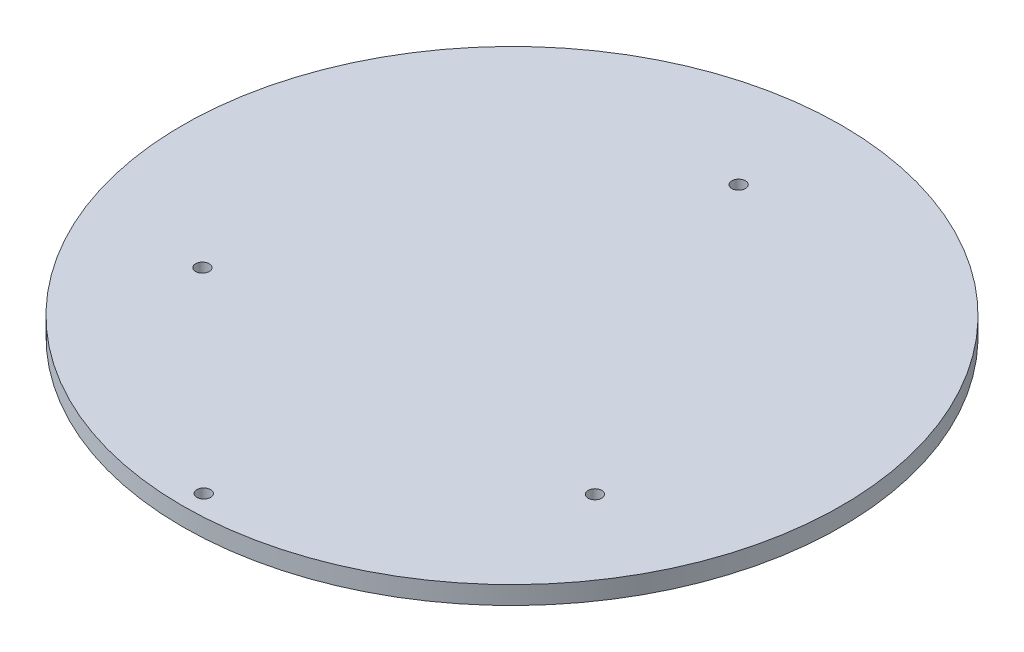
ISO-10303-21;
HEADER;
FILE_DESCRIPTION(('STEP AP214'),'2;1');
FILE_NAME('part.step','',(''),(''),'','','');
FILE_SCHEMA(('AUTOMOTIVE_DESIGN { 1 0 10303 214 1 1 1 1 }'));
ENDSEC;
DATA;
#1=APPLICATION_CONTEXT('core data for automotive mechanical design processes');
#2=APPLICATION_PROTOCOL_DEFINITION('international standard','automotive_design',2000,#1);
#3=PRODUCT_CONTEXT('',#1,'mechanical');
#4=PRODUCT('Part','Part','',(#3));
#5=PRODUCT_RELATED_PRODUCT_CATEGORY('part','',(#4));
#6=PRODUCT_DEFINITION_FORMATION('','',#4);
#7=PRODUCT_DEFINITION_CONTEXT('part definition',#1,'design');
#8=PRODUCT_DEFINITION('design','',#6,#7);
#9=PRODUCT_DEFINITION_SHAPE('','',#8);
#10=(LENGTH_UNIT() NAMED_UNIT(*) SI_UNIT(.MILLI.,.METRE.));
#11=(NAMED_UNIT(*) PLANE_ANGLE_UNIT() SI_UNIT($,.RADIAN.));
#12=(NAMED_UNIT(*) SI_UNIT($,.STERADIAN.) SOLID_ANGLE_UNIT());
#13=UNCERTAINTY_MEASURE_WITH_UNIT(LENGTH_MEASURE(1.E-05),#10,'distance_accuracy_value','');
#14=(GEOMETRIC_REPRESENTATION_CONTEXT(3) GLOBAL_UNCERTAINTY_ASSIGNED_CONTEXT((#13)) GLOBAL_UNIT_ASSIGNED_CONTEXT((#10,
#11,#12)) REPRESENTATION_CONTEXT('',''));
#15=CARTESIAN_POINT('',(0.,0.,0.));
#16=DIRECTION('',(0.,0.,1.));
#17=DIRECTION('',(1.,0.,0.));
#18=AXIS2_PLACEMENT_3D('',#15,#16,#17);
#19=CARTESIAN_POINT('',(0.,4.,0.));
#20=DIRECTION('',(0.,-1.,0.));
#21=DIRECTION('',(0.,0.,-1.));
#22=AXIS2_PLACEMENT_3D('',#19,#20,#21);
#23=CYLINDRICAL_SURFACE('',#22,72.7);
#24=CARTESIAN_POINT('',(0.,4.,0.));
#25=DIRECTION('',(0.,1.,0.));
#26=DIRECTION('',(0.,0.,1.));
#27=AXIS2_PLACEMENT_3D('',#24,#25,#26);
#28=CIRCLE('',#27,72.7);
#29=CARTESIAN_POINT('',(0.,4.,72.7));
#30=VERTEX_POINT('',#29);
#31=EDGE_CURVE('E10',#30,#30,#28,.T.);
#32=ORIENTED_EDGE('',*,*,#31,.F.);
#33=EDGE_LOOP('',(#32));
#34=FACE_BOUND('',#33,.T.);
#35=CARTESIAN_POINT('',(0.,0.,0.));
#36=DIRECTION('',(0.,1.,0.));
#37=DIRECTION('',(0.,0.,1.));
#38=AXIS2_PLACEMENT_3D('',#35,#36,#37);
#39=CIRCLE('',#38,72.7);
#40=CARTESIAN_POINT('',(0.,0.,72.7));
#41=VERTEX_POINT('',#40);
#42=EDGE_CURVE('E34',#41,#41,#39,.T.);
#43=ORIENTED_EDGE('',*,*,#42,.T.);
#44=EDGE_LOOP('',(#43));
#45=FACE_BOUND('',#44,.T.);
#46=ADVANCED_FACE('F31',(#34,#45),#23,.T.);
#47=CARTESIAN_POINT('',(0.,4.,0.));
#48=DIRECTION('',(0.,1.,0.));
#49=DIRECTION('',(0.,0.,1.));
#50=AXIS2_PLACEMENT_3D('',#47,#48,#49);
#51=PLANE('',#50);
#52=CARTESIAN_POINT('',(0.,4.,68.));
#53=DIRECTION('',(0.,1.,0.));
#54=DIRECTION('',(0.,0.,1.));
#55=AXIS2_PLACEMENT_3D('',#52,#53,#54);
#56=CIRCLE('',#55,1.5);
#57=CARTESIAN_POINT('',(0.,4.,69.5));
#58=VERTEX_POINT('',#57);
#59=EDGE_CURVE('E61',#58,#58,#56,.T.);
#60=ORIENTED_EDGE('',*,*,#59,.F.);
#61=EDGE_LOOP('',(#60));
#62=FACE_BOUND('',#61,.T.);
#63=CARTESIAN_POINT('',(-43.3012701892222,4.,24.9999999999996));
#64=DIRECTION('',(0.,1.,0.));
#65=DIRECTION('',(0.866025403784443,0.,-0.499999999999992));
#66=AXIS2_PLACEMENT_3D('',#63,#64,#65);
#67=CIRCLE('',#66,1.5);
#68=CARTESIAN_POINT('',(-42.0022320835455,4.,24.2499999999996));
#69=VERTEX_POINT('',#68);
#70=EDGE_CURVE('E55',#69,#69,#67,.T.);
#71=ORIENTED_EDGE('',*,*,#70,.F.);
#72=EDGE_LOOP('',(#71));
#73=FACE_BOUND('',#72,.T.);
#74=CARTESIAN_POINT('',(43.3012701892218,4.,25.0000000000002));
#75=DIRECTION('',(0.,1.,0.));
#76=DIRECTION('',(-0.866025403784436,0.,-0.500000000000004));
#77=AXIS2_PLACEMENT_3D('',#74,#75,#76);
#78=CIRCLE('',#77,1.5);
#79=CARTESIAN_POINT('',(42.0022320835452,4.,24.2500000000002));
#80=VERTEX_POINT('',#79);
#81=EDGE_CURVE('E49',#80,#80,#78,.T.);
#82=ORIENTED_EDGE('',*,*,#81,.F.);
#83=EDGE_LOOP('',(#82));
#84=FACE_BOUND('',#83,.T.);
#85=CARTESIAN_POINT('',(0.,4.,-50.));
#86=DIRECTION('',(0.,1.,0.));
#87=DIRECTION('',(0.,0.,1.));
#88=AXIS2_PLACEMENT_3D('',#85,#86,#87);
#89=CIRCLE('',#88,1.5);
#90=CARTESIAN_POINT('',(0.,4.,-48.5));
#91=VERTEX_POINT('',#90);
#92=EDGE_CURVE('E43',#91,#91,#89,.T.);
#93=ORIENTED_EDGE('',*,*,#92,.F.);
#94=EDGE_LOOP('',(#93));
#95=FACE_BOUND('',#94,.T.);
#96=ORIENTED_EDGE('',*,*,#31,.T.);
#97=EDGE_LOOP('',(#96));
#98=FACE_BOUND('',#97,.T.);
#99=ADVANCED_FACE('F77',(#62,#73,#84,#95,#98),#51,.T.);
#100=CARTESIAN_POINT('',(0.,0.,0.));
#101=DIRECTION('',(0.,1.,0.));
#102=DIRECTION('',(0.,0.,1.));
#103=AXIS2_PLACEMENT_3D('',#100,#101,#102);
#104=PLANE('',#103);
#105=CARTESIAN_POINT('',(0.,0.,68.));
#106=DIRECTION('',(0.,1.,0.));
#107=DIRECTION('',(0.,0.,1.));
#108=AXIS2_PLACEMENT_3D('',#105,#106,#107);
#109=CIRCLE('',#108,1.5);
#110=CARTESIAN_POINT('',(0.,0.,69.5));
#111=VERTEX_POINT('',#110);
#112=EDGE_CURVE('E58',#111,#111,#109,.T.);
#113=ORIENTED_EDGE('',*,*,#112,.T.);
#114=EDGE_LOOP('',(#113));
#115=FACE_BOUND('',#114,.T.);
#116=CARTESIAN_POINT('',(-43.3012701892222,0.,24.9999999999996));
#117=DIRECTION('',(0.,1.,0.));
#118=DIRECTION('',(0.866025403784443,0.,-0.499999999999992));
#119=AXIS2_PLACEMENT_3D('',#116,#117,#118);
#120=CIRCLE('',#119,1.5);
#121=CARTESIAN_POINT('',(-42.0022320835455,0.,24.2499999999996));
#122=VERTEX_POINT('',#121);
#123=EDGE_CURVE('E52',#122,#122,#120,.T.);
#124=ORIENTED_EDGE('',*,*,#123,.T.);
#125=EDGE_LOOP('',(#124));
#126=FACE_BOUND('',#125,.T.);
#127=CARTESIAN_POINT('',(43.3012701892218,0.,25.0000000000002));
#128=DIRECTION('',(0.,1.,0.));
#129=DIRECTION('',(-0.866025403784436,0.,-0.500000000000004));
#130=AXIS2_PLACEMENT_3D('',#127,#128,#129);
#131=CIRCLE('',#130,1.5);
#132=CARTESIAN_POINT('',(42.0022320835452,0.,24.2500000000002));
#133=VERTEX_POINT('',#132);
#134=EDGE_CURVE('E46',#133,#133,#131,.T.);
#135=ORIENTED_EDGE('',*,*,#134,.T.);
#136=EDGE_LOOP('',(#135));
#137=FACE_BOUND('',#136,.T.);
#138=CARTESIAN_POINT('',(0.,0.,-50.));
#139=DIRECTION('',(0.,1.,0.));
#140=DIRECTION('',(0.,0.,1.));
#141=AXIS2_PLACEMENT_3D('',#138,#139,#140);
#142=CIRCLE('',#141,1.5);
#143=CARTESIAN_POINT('',(0.,0.,-48.5));
#144=VERTEX_POINT('',#143);
#145=EDGE_CURVE('E41',#144,#144,#142,.T.);
#146=ORIENTED_EDGE('',*,*,#145,.T.);
#147=EDGE_LOOP('',(#146));
#148=FACE_BOUND('',#147,.T.);
#149=ORIENTED_EDGE('',*,*,#42,.F.);
#150=EDGE_LOOP('',(#149));
#151=FACE_BOUND('',#150,.T.);
#152=ADVANCED_FACE('F67',(#115,#126,#137,#148,#151),#104,.F.);
#153=CARTESIAN_POINT('',(0.,0.,-50.));
#154=DIRECTION('',(0.,1.,0.));
#155=DIRECTION('',(0.,0.,1.));
#156=AXIS2_PLACEMENT_3D('',#153,#154,#155);
#157=CYLINDRICAL_SURFACE('',#156,1.5);
#158=ORIENTED_EDGE('',*,*,#145,.F.);
#159=EDGE_LOOP('',(#158));
#160=FACE_BOUND('',#159,.T.);
#161=ORIENTED_EDGE('',*,*,#92,.T.);
#162=EDGE_LOOP('',(#161));
#163=FACE_BOUND('',#162,.T.);
#164=ADVANCED_FACE('F87',(#160,#163),#157,.F.);
#165=CARTESIAN_POINT('',(43.3012701892218,0.,25.0000000000002));
#166=DIRECTION('',(0.,1.,0.));
#167=DIRECTION('',(0.,0.,1.));
#168=AXIS2_PLACEMENT_3D('',#165,#166,#167);
#169=CYLINDRICAL_SURFACE('',#168,1.5);
#170=ORIENTED_EDGE('',*,*,#134,.F.);
#171=EDGE_LOOP('',(#170));
#172=FACE_BOUND('',#171,.T.);
#173=ORIENTED_EDGE('',*,*,#81,.T.);
#174=EDGE_LOOP('',(#173));
#175=FACE_BOUND('',#174,.T.);
#176=ADVANCED_FACE('F89',(#172,#175),#169,.F.);
#177=CARTESIAN_POINT('',(-43.3012701892222,0.,24.9999999999996));
#178=DIRECTION('',(0.,1.,0.));
#179=DIRECTION('',(0.,0.,1.));
#180=AXIS2_PLACEMENT_3D('',#177,#178,#179);
#181=CYLINDRICAL_SURFACE('',#180,1.5);
#182=ORIENTED_EDGE('',*,*,#123,.F.);
#183=EDGE_LOOP('',(#182));
#184=FACE_BOUND('',#183,.T.);
#185=ORIENTED_EDGE('',*,*,#70,.T.);
#186=EDGE_LOOP('',(#185));
#187=FACE_BOUND('',#186,.T.);
#188=ADVANCED_FACE('F73',(#184,#187),#181,.F.);
#189=CARTESIAN_POINT('',(0.,0.,68.));
#190=DIRECTION('',(0.,1.,0.));
#191=DIRECTION('',(0.,0.,1.));
#192=AXIS2_PLACEMENT_3D('',#189,#190,#191);
#193=CYLINDRICAL_SURFACE('',#192,1.5);
#194=ORIENTED_EDGE('',*,*,#112,.F.);
#195=EDGE_LOOP('',(#194));
#196=FACE_BOUND('',#195,.T.);
#197=ORIENTED_EDGE('',*,*,#59,.T.);
#198=EDGE_LOOP('',(#197));
#199=FACE_BOUND('',#198,.T.);
#200=ADVANCED_FACE('F70',(#196,#199),#193,.F.);
#201=CLOSED_SHELL('',(#46,#99,#152,#164,#176,#188,#200));
#202=MANIFOLD_SOLID_BREP('B2',#201);
#203=ADVANCED_BREP_SHAPE_REPRESENTATION('',(#18,#202),#14);
#204=SHAPE_DEFINITION_REPRESENTATION(#9,#203);
ENDSEC;
END-ISO-10303-21;
